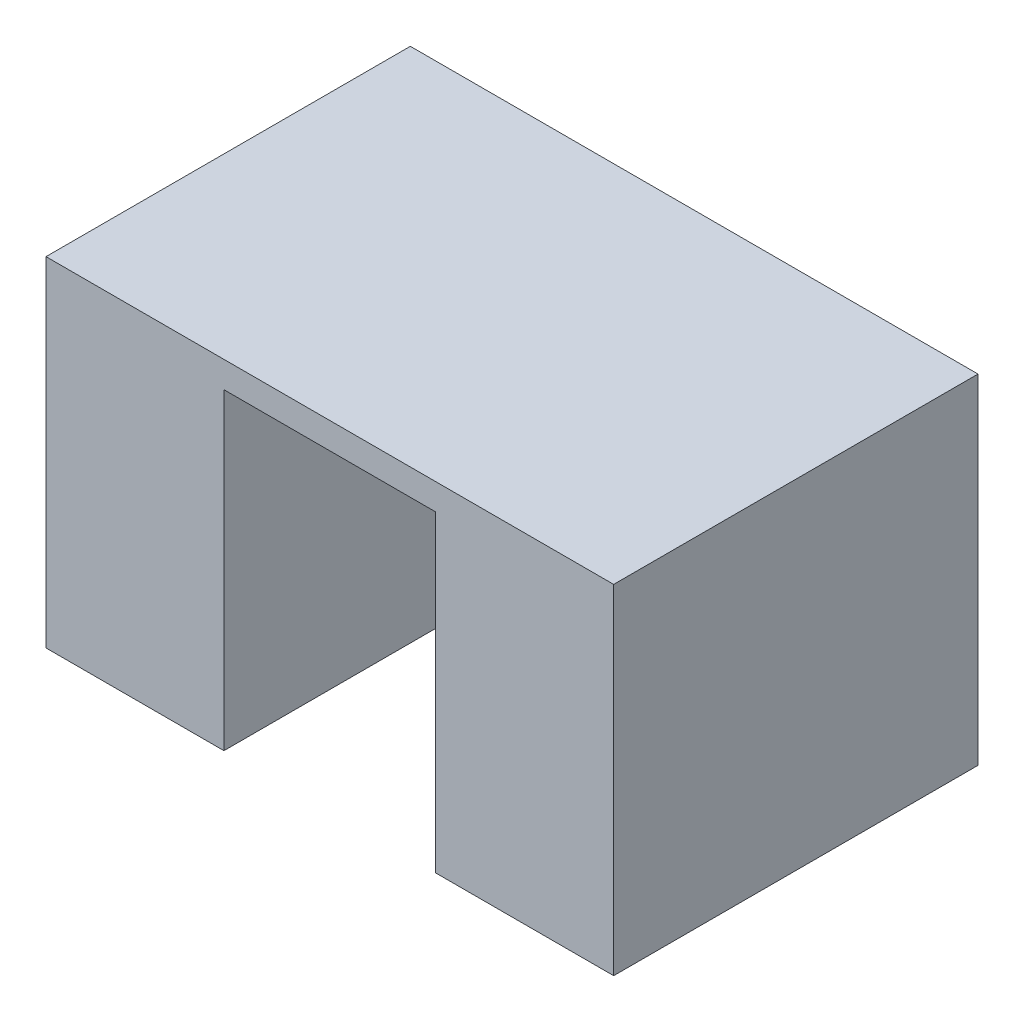
ISO-10303-21;
HEADER;
FILE_DESCRIPTION(('STEP AP214'),'2;1');
FILE_NAME('part.step','',(''),(''),'','','');
FILE_SCHEMA(('AUTOMOTIVE_DESIGN { 1 0 10303 214 1 1 1 1 }'));
ENDSEC;
DATA;
#1=APPLICATION_CONTEXT('core data for automotive mechanical design processes');
#2=APPLICATION_PROTOCOL_DEFINITION('international standard','automotive_design',2000,#1);
#3=PRODUCT_CONTEXT('',#1,'mechanical');
#4=PRODUCT('Part','Part','',(#3));
#5=PRODUCT_RELATED_PRODUCT_CATEGORY('part','',(#4));
#6=PRODUCT_DEFINITION_FORMATION('','',#4);
#7=PRODUCT_DEFINITION_CONTEXT('part definition',#1,'design');
#8=PRODUCT_DEFINITION('design','',#6,#7);
#9=PRODUCT_DEFINITION_SHAPE('','',#8);
#10=(LENGTH_UNIT() NAMED_UNIT(*) SI_UNIT(.MILLI.,.METRE.));
#11=(NAMED_UNIT(*) PLANE_ANGLE_UNIT() SI_UNIT($,.RADIAN.));
#12=(NAMED_UNIT(*) SI_UNIT($,.STERADIAN.) SOLID_ANGLE_UNIT());
#13=UNCERTAINTY_MEASURE_WITH_UNIT(LENGTH_MEASURE(1.E-05),#10,'distance_accuracy_value','');
#14=(GEOMETRIC_REPRESENTATION_CONTEXT(3) GLOBAL_UNCERTAINTY_ASSIGNED_CONTEXT((#13)) GLOBAL_UNIT_ASSIGNED_CONTEXT((#10,
#11,#12)) REPRESENTATION_CONTEXT('',''));
#15=CARTESIAN_POINT('',(0.,0.,0.));
#16=DIRECTION('',(0.,0.,1.));
#17=DIRECTION('',(1.,0.,0.));
#18=AXIS2_PLACEMENT_3D('',#15,#16,#17);
#19=CARTESIAN_POINT('',(-67.,40.,7.50000000000001));
#20=DIRECTION('',(0.,0.,-1.));
#21=DIRECTION('',(-1.,0.,0.));
#22=AXIS2_PLACEMENT_3D('',#19,#20,#21);
#23=PLANE('',#22);
#24=DIRECTION('',(0.,-1.,0.));
#25=VECTOR('',#24,1.);
#26=CARTESIAN_POINT('',(-46.,36.9,7.50000000000001));
#27=LINE('',#26,#25);
#28=CARTESIAN_POINT('',(-46.,36.9,7.50000000000001));
#29=VERTEX_POINT('',#28);
#30=CARTESIAN_POINT('',(-46.,0.,7.50000000000001));
#31=VERTEX_POINT('',#30);
#32=EDGE_CURVE('E124',#29,#31,#27,.T.);
#33=ORIENTED_EDGE('',*,*,#32,.F.);
#34=DIRECTION('',(1.,0.,0.));
#35=VECTOR('',#34,1.);
#36=CARTESIAN_POINT('',(0.,36.9,7.5));
#37=LINE('',#36,#35);
#38=CARTESIAN_POINT('',(-21.,36.9,7.5));
#39=VERTEX_POINT('',#38);
#40=EDGE_CURVE('E132',#29,#39,#37,.T.);
#41=ORIENTED_EDGE('',*,*,#40,.T.);
#42=DIRECTION('',(0.,-1.,0.));
#43=VECTOR('',#42,1.);
#44=CARTESIAN_POINT('',(-21.,36.9,7.5));
#45=LINE('',#44,#43);
#46=CARTESIAN_POINT('',(-21.,0.,7.5));
#47=VERTEX_POINT('',#46);
#48=EDGE_CURVE('E153',#39,#47,#45,.T.);
#49=ORIENTED_EDGE('',*,*,#48,.T.);
#50=DIRECTION('',(1.,0.,0.));
#51=VECTOR('',#50,1.);
#52=CARTESIAN_POINT('',(-67.,0.,7.50000000000001));
#53=LINE('',#52,#51);
#54=CARTESIAN_POINT('',(0.,0.,7.5));
#55=VERTEX_POINT('',#54);
#56=EDGE_CURVE('E123',#47,#55,#53,.T.);
#57=ORIENTED_EDGE('',*,*,#56,.T.);
#58=DIRECTION('',(0.,-1.,0.));
#59=VECTOR('',#58,1.);
#60=CARTESIAN_POINT('',(0.,40.,7.5));
#61=LINE('',#60,#59);
#62=CARTESIAN_POINT('',(0.,40.,7.5));
#63=VERTEX_POINT('',#62);
#64=EDGE_CURVE('E11',#63,#55,#61,.T.);
#65=ORIENTED_EDGE('',*,*,#64,.F.);
#66=DIRECTION('',(1.,0.,0.));
#67=VECTOR('',#66,1.);
#68=CARTESIAN_POINT('',(-67.,40.,7.50000000000001));
#69=LINE('',#68,#67);
#70=CARTESIAN_POINT('',(-67.,40.,7.50000000000001));
#71=VERTEX_POINT('',#70);
#72=EDGE_CURVE('E159',#71,#63,#69,.T.);
#73=ORIENTED_EDGE('',*,*,#72,.F.);
#74=DIRECTION('',(0.,-1.,0.));
#75=VECTOR('',#74,1.);
#76=CARTESIAN_POINT('',(-67.,40.,7.50000000000001));
#77=LINE('',#76,#75);
#78=CARTESIAN_POINT('',(-67.,0.,7.50000000000001));
#79=VERTEX_POINT('',#78);
#80=EDGE_CURVE('E63',#71,#79,#77,.T.);
#81=ORIENTED_EDGE('',*,*,#80,.T.);
#82=EDGE_CURVE('E172',#79,#31,#53,.T.);
#83=ORIENTED_EDGE('',*,*,#82,.T.);
#84=EDGE_LOOP('',(#33,#41,#49,#57,#65,#73,#81,#83));
#85=FACE_BOUND('',#84,.T.);
#86=ADVANCED_FACE('F39',(#85),#23,.F.);
#87=CARTESIAN_POINT('',(-67.,40.,-35.5));
#88=DIRECTION('',(0.,0.,-1.));
#89=DIRECTION('',(-1.,0.,0.));
#90=AXIS2_PLACEMENT_3D('',#87,#88,#89);
#91=PLANE('',#90);
#92=DIRECTION('',(1.,0.,0.));
#93=VECTOR('',#92,1.);
#94=CARTESIAN_POINT('',(0.,36.9,-35.5));
#95=LINE('',#94,#93);
#96=CARTESIAN_POINT('',(-46.,36.9,-35.5));
#97=VERTEX_POINT('',#96);
#98=CARTESIAN_POINT('',(-21.,36.9,-35.5));
#99=VERTEX_POINT('',#98);
#100=EDGE_CURVE('E130',#97,#99,#95,.T.);
#101=ORIENTED_EDGE('',*,*,#100,.F.);
#102=DIRECTION('',(0.,-1.,0.));
#103=VECTOR('',#102,1.);
#104=CARTESIAN_POINT('',(-46.,36.9,-35.5));
#105=LINE('',#104,#103);
#106=CARTESIAN_POINT('',(-46.,0.,-35.5));
#107=VERTEX_POINT('',#106);
#108=EDGE_CURVE('E111',#97,#107,#105,.T.);
#109=ORIENTED_EDGE('',*,*,#108,.T.);
#110=DIRECTION('',(1.,0.,0.));
#111=VECTOR('',#110,1.);
#112=CARTESIAN_POINT('',(-67.,0.,-35.5));
#113=LINE('',#112,#111);
#114=CARTESIAN_POINT('',(-67.,0.,-35.5));
#115=VERTEX_POINT('',#114);
#116=EDGE_CURVE('E180',#115,#107,#113,.T.);
#117=ORIENTED_EDGE('',*,*,#116,.F.);
#118=DIRECTION('',(0.,-1.,0.));
#119=VECTOR('',#118,1.);
#120=CARTESIAN_POINT('',(-67.,40.,-35.5));
#121=LINE('',#120,#119);
#122=CARTESIAN_POINT('',(-67.,40.,-35.5));
#123=VERTEX_POINT('',#122);
#124=EDGE_CURVE('E188',#123,#115,#121,.T.);
#125=ORIENTED_EDGE('',*,*,#124,.F.);
#126=DIRECTION('',(1.,0.,0.));
#127=VECTOR('',#126,1.);
#128=CARTESIAN_POINT('',(-67.,40.,-35.5));
#129=LINE('',#128,#127);
#130=CARTESIAN_POINT('',(0.,40.,-35.5));
#131=VERTEX_POINT('',#130);
#132=EDGE_CURVE('E165',#123,#131,#129,.T.);
#133=ORIENTED_EDGE('',*,*,#132,.T.);
#134=DIRECTION('',(0.,-1.,0.));
#135=VECTOR('',#134,1.);
#136=CARTESIAN_POINT('',(0.,40.,-35.5));
#137=LINE('',#136,#135);
#138=CARTESIAN_POINT('',(0.,0.,-35.5));
#139=VERTEX_POINT('',#138);
#140=EDGE_CURVE('E47',#131,#139,#137,.T.);
#141=ORIENTED_EDGE('',*,*,#140,.T.);
#142=CARTESIAN_POINT('',(-21.,0.,-35.5));
#143=VERTEX_POINT('',#142);
#144=EDGE_CURVE('E179',#143,#139,#113,.T.);
#145=ORIENTED_EDGE('',*,*,#144,.F.);
#146=DIRECTION('',(0.,-1.,0.));
#147=VECTOR('',#146,1.);
#148=CARTESIAN_POINT('',(-21.,36.9,-35.5));
#149=LINE('',#148,#147);
#150=EDGE_CURVE('E54',#99,#143,#149,.T.);
#151=ORIENTED_EDGE('',*,*,#150,.F.);
#152=EDGE_LOOP('',(#101,#109,#117,#125,#133,#141,#145,#151));
#153=FACE_BOUND('',#152,.T.);
#154=ADVANCED_FACE('F136',(#153),#91,.T.);
#155=CARTESIAN_POINT('',(0.,0.,0.));
#156=DIRECTION('',(0.,1.,0.));
#157=DIRECTION('',(0.,0.,1.));
#158=AXIS2_PLACEMENT_3D('',#155,#156,#157);
#159=PLANE('',#158);
#160=DIRECTION('',(0.,0.,1.));
#161=VECTOR('',#160,1.);
#162=CARTESIAN_POINT('',(-46.,0.,0.));
#163=LINE('',#162,#161);
#164=EDGE_CURVE('E117',#107,#31,#163,.T.);
#165=ORIENTED_EDGE('',*,*,#164,.T.);
#166=ORIENTED_EDGE('',*,*,#82,.F.);
#167=DIRECTION('',(0.,0.,-1.));
#168=VECTOR('',#167,1.);
#169=CARTESIAN_POINT('',(-67.,0.,7.50000000000001));
#170=LINE('',#169,#168);
#171=EDGE_CURVE('E162',#79,#115,#170,.T.);
#172=ORIENTED_EDGE('',*,*,#171,.T.);
#173=ORIENTED_EDGE('',*,*,#116,.T.);
#174=EDGE_LOOP('',(#165,#166,#172,#173));
#175=FACE_BOUND('',#174,.T.);
#176=ADVANCED_FACE('F215',(#175),#159,.F.);
#177=DIRECTION('',(0.,0.,-1.));
#178=VECTOR('',#177,1.);
#179=CARTESIAN_POINT('',(-21.,0.,0.));
#180=LINE('',#179,#178);
#181=EDGE_CURVE('E139',#47,#143,#180,.T.);
#182=ORIENTED_EDGE('',*,*,#181,.T.);
#183=ORIENTED_EDGE('',*,*,#144,.T.);
#184=DIRECTION('',(0.,0.,-1.));
#185=VECTOR('',#184,1.);
#186=CARTESIAN_POINT('',(0.,0.,7.5));
#187=LINE('',#186,#185);
#188=EDGE_CURVE('E175',#55,#139,#187,.T.);
#189=ORIENTED_EDGE('',*,*,#188,.F.);
#190=ORIENTED_EDGE('',*,*,#56,.F.);
#191=EDGE_LOOP('',(#182,#183,#189,#190));
#192=FACE_BOUND('',#191,.T.);
#193=ADVANCED_FACE('F198',(#192),#159,.F.);
#194=CARTESIAN_POINT('',(0.,40.,7.5));
#195=DIRECTION('',(-1.,0.,0.));
#196=DIRECTION('',(0.,0.,1.));
#197=AXIS2_PLACEMENT_3D('',#194,#195,#196);
#198=PLANE('',#197);
#199=ORIENTED_EDGE('',*,*,#188,.T.);
#200=ORIENTED_EDGE('',*,*,#140,.F.);
#201=DIRECTION('',(0.,0.,-1.));
#202=VECTOR('',#201,1.);
#203=CARTESIAN_POINT('',(0.,40.,7.5));
#204=LINE('',#203,#202);
#205=EDGE_CURVE('E89',#63,#131,#204,.T.);
#206=ORIENTED_EDGE('',*,*,#205,.F.);
#207=ORIENTED_EDGE('',*,*,#64,.T.);
#208=EDGE_LOOP('',(#199,#200,#206,#207));
#209=FACE_BOUND('',#208,.T.);
#210=ADVANCED_FACE('F194',(#209),#198,.F.);
#211=CARTESIAN_POINT('',(-67.,40.,7.50000000000001));
#212=DIRECTION('',(-1.,0.,0.));
#213=DIRECTION('',(0.,0.,1.));
#214=AXIS2_PLACEMENT_3D('',#211,#212,#213);
#215=PLANE('',#214);
#216=ORIENTED_EDGE('',*,*,#171,.F.);
#217=ORIENTED_EDGE('',*,*,#80,.F.);
#218=DIRECTION('',(0.,0.,-1.));
#219=VECTOR('',#218,1.);
#220=CARTESIAN_POINT('',(-67.,40.,7.50000000000001));
#221=LINE('',#220,#219);
#222=EDGE_CURVE('E169',#71,#123,#221,.T.);
#223=ORIENTED_EDGE('',*,*,#222,.T.);
#224=ORIENTED_EDGE('',*,*,#124,.T.);
#225=EDGE_LOOP('',(#216,#217,#223,#224));
#226=FACE_BOUND('',#225,.T.);
#227=ADVANCED_FACE('F223',(#226),#215,.T.);
#228=CARTESIAN_POINT('',(0.,40.,0.));
#229=DIRECTION('',(0.,1.,0.));
#230=DIRECTION('',(0.,0.,1.));
#231=AXIS2_PLACEMENT_3D('',#228,#229,#230);
#232=PLANE('',#231);
#233=ORIENTED_EDGE('',*,*,#72,.T.);
#234=ORIENTED_EDGE('',*,*,#205,.T.);
#235=ORIENTED_EDGE('',*,*,#132,.F.);
#236=ORIENTED_EDGE('',*,*,#222,.F.);
#237=EDGE_LOOP('',(#233,#234,#235,#236));
#238=FACE_BOUND('',#237,.T.);
#239=ADVANCED_FACE('F209',(#238),#232,.T.);
#240=CARTESIAN_POINT('',(-46.,36.9,0.));
#241=DIRECTION('',(1.,0.,0.));
#242=DIRECTION('',(0.,0.,-1.));
#243=AXIS2_PLACEMENT_3D('',#240,#241,#242);
#244=PLANE('',#243);
#245=ORIENTED_EDGE('',*,*,#164,.F.);
#246=ORIENTED_EDGE('',*,*,#108,.F.);
#247=DIRECTION('',(0.,0.,1.));
#248=VECTOR('',#247,1.);
#249=CARTESIAN_POINT('',(-46.,36.9,0.));
#250=LINE('',#249,#248);
#251=EDGE_CURVE('E114',#97,#29,#250,.T.);
#252=ORIENTED_EDGE('',*,*,#251,.T.);
#253=ORIENTED_EDGE('',*,*,#32,.T.);
#254=EDGE_LOOP('',(#245,#246,#252,#253));
#255=FACE_BOUND('',#254,.T.);
#256=ADVANCED_FACE('F113',(#255),#244,.T.);
#257=CARTESIAN_POINT('',(-21.,36.9,0.));
#258=DIRECTION('',(-1.,0.,0.));
#259=DIRECTION('',(0.,0.,1.));
#260=AXIS2_PLACEMENT_3D('',#257,#258,#259);
#261=PLANE('',#260);
#262=ORIENTED_EDGE('',*,*,#181,.F.);
#263=ORIENTED_EDGE('',*,*,#48,.F.);
#264=DIRECTION('',(0.,0.,-1.));
#265=VECTOR('',#264,1.);
#266=CARTESIAN_POINT('',(-21.,36.9,0.));
#267=LINE('',#266,#265);
#268=EDGE_CURVE('E146',#39,#99,#267,.T.);
#269=ORIENTED_EDGE('',*,*,#268,.T.);
#270=ORIENTED_EDGE('',*,*,#150,.T.);
#271=EDGE_LOOP('',(#262,#263,#269,#270));
#272=FACE_BOUND('',#271,.T.);
#273=ADVANCED_FACE('F201',(#272),#261,.T.);
#274=CARTESIAN_POINT('',(0.,36.9,0.));
#275=DIRECTION('',(0.,1.,0.));
#276=DIRECTION('',(0.,0.,1.));
#277=AXIS2_PLACEMENT_3D('',#274,#275,#276);
#278=PLANE('',#277);
#279=ORIENTED_EDGE('',*,*,#100,.T.);
#280=ORIENTED_EDGE('',*,*,#268,.F.);
#281=ORIENTED_EDGE('',*,*,#40,.F.);
#282=ORIENTED_EDGE('',*,*,#251,.F.);
#283=EDGE_LOOP('',(#279,#280,#281,#282));
#284=FACE_BOUND('',#283,.T.);
#285=ADVANCED_FACE('F128',(#284),#278,.F.);
#286=CLOSED_SHELL('',(#86,#154,#176,#193,#210,#227,#239,#256,#273,#285));
#287=MANIFOLD_SOLID_BREP('B2',#286);
#288=ADVANCED_BREP_SHAPE_REPRESENTATION('',(#18,#287),#14);
#289=SHAPE_DEFINITION_REPRESENTATION(#9,#288);
ENDSEC;
END-ISO-10303-21;
